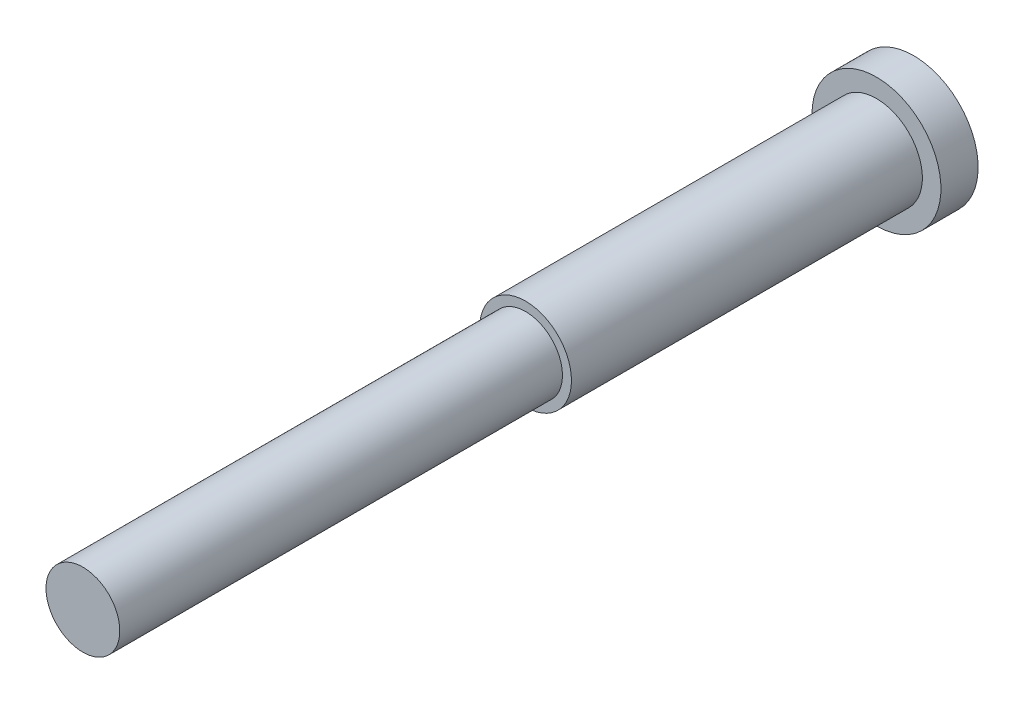
ISO-10303-21;
HEADER;
FILE_DESCRIPTION(('STEP AP214'),'2;1');
FILE_NAME('part.step','',(''),(''),'','','');
FILE_SCHEMA(('AUTOMOTIVE_DESIGN { 1 0 10303 214 1 1 1 1 }'));
ENDSEC;
DATA;
#1=APPLICATION_CONTEXT('core data for automotive mechanical design processes');
#2=APPLICATION_PROTOCOL_DEFINITION('international standard','automotive_design',2000,#1);
#3=PRODUCT_CONTEXT('',#1,'mechanical');
#4=PRODUCT('Part','Part','',(#3));
#5=PRODUCT_RELATED_PRODUCT_CATEGORY('part','',(#4));
#6=PRODUCT_DEFINITION_FORMATION('','',#4);
#7=PRODUCT_DEFINITION_CONTEXT('part definition',#1,'design');
#8=PRODUCT_DEFINITION('design','',#6,#7);
#9=PRODUCT_DEFINITION_SHAPE('','',#8);
#10=(LENGTH_UNIT() NAMED_UNIT(*) SI_UNIT(.MILLI.,.METRE.));
#11=(NAMED_UNIT(*) PLANE_ANGLE_UNIT() SI_UNIT($,.RADIAN.));
#12=(NAMED_UNIT(*) SI_UNIT($,.STERADIAN.) SOLID_ANGLE_UNIT());
#13=UNCERTAINTY_MEASURE_WITH_UNIT(LENGTH_MEASURE(1.E-05),#10,'distance_accuracy_value','');
#14=(GEOMETRIC_REPRESENTATION_CONTEXT(3) GLOBAL_UNCERTAINTY_ASSIGNED_CONTEXT((#13)) GLOBAL_UNIT_ASSIGNED_CONTEXT((#10,
#11,#12)) REPRESENTATION_CONTEXT('',''));
#15=CARTESIAN_POINT('',(0.,0.,0.));
#16=DIRECTION('',(0.,0.,1.));
#17=DIRECTION('',(1.,0.,0.));
#18=AXIS2_PLACEMENT_3D('',#15,#16,#17);
#19=CARTESIAN_POINT('',(0.,0.,60.4));
#20=DIRECTION('',(0.,0.,1.));
#21=DIRECTION('',(1.,0.,0.));
#22=AXIS2_PLACEMENT_3D('',#19,#20,#21);
#23=PLANE('',#22);
#24=CARTESIAN_POINT('',(0.,0.,60.4));
#25=DIRECTION('',(0.,0.,1.));
#26=DIRECTION('',(1.,0.,0.));
#27=AXIS2_PLACEMENT_3D('',#24,#25,#26);
#28=CIRCLE('',#27,7.9);
#29=CARTESIAN_POINT('',(7.9,0.,60.4));
#30=VERTEX_POINT('',#29);
#31=EDGE_CURVE('E10',#30,#30,#28,.T.);
#32=ORIENTED_EDGE('',*,*,#31,.T.);
#33=EDGE_LOOP('',(#32));
#34=FACE_BOUND('',#33,.T.);
#35=CARTESIAN_POINT('',(0.,0.,60.4));
#36=DIRECTION('',(0.,0.,1.));
#37=DIRECTION('',(1.,0.,0.));
#38=AXIS2_PLACEMENT_3D('',#35,#36,#37);
#39=CIRCLE('',#38,6.35);
#40=CARTESIAN_POINT('',(-6.35,0.,60.4));
#41=VERTEX_POINT('',#40);
#42=EDGE_CURVE('E43',#41,#41,#39,.T.);
#43=ORIENTED_EDGE('',*,*,#42,.F.);
#44=EDGE_LOOP('',(#43));
#45=FACE_BOUND('',#44,.T.);
#46=ADVANCED_FACE('F32',(#34,#45),#23,.T.);
#47=CARTESIAN_POINT('',(0.,0.,60.4));
#48=DIRECTION('',(0.,0.,-1.));
#49=DIRECTION('',(-1.,0.,0.));
#50=AXIS2_PLACEMENT_3D('',#47,#48,#49);
#51=CYLINDRICAL_SURFACE('',#50,7.9);
#52=ORIENTED_EDGE('',*,*,#31,.F.);
#53=EDGE_LOOP('',(#52));
#54=FACE_BOUND('',#53,.T.);
#55=CARTESIAN_POINT('',(0.,0.,0.));
#56=DIRECTION('',(0.,0.,-1.));
#57=DIRECTION('',(-1.,0.,0.));
#58=AXIS2_PLACEMENT_3D('',#55,#56,#57);
#59=CIRCLE('',#58,7.9);
#60=CARTESIAN_POINT('',(-7.9,0.,0.));
#61=VERTEX_POINT('',#60);
#62=EDGE_CURVE('E48',#61,#61,#59,.T.);
#63=ORIENTED_EDGE('',*,*,#62,.F.);
#64=EDGE_LOOP('',(#63));
#65=FACE_BOUND('',#64,.T.);
#66=ADVANCED_FACE('F34',(#54,#65),#51,.T.);
#67=CARTESIAN_POINT('',(0.,0.,136.6));
#68=DIRECTION('',(0.,0.,-1.));
#69=DIRECTION('',(-1.,0.,0.));
#70=AXIS2_PLACEMENT_3D('',#67,#68,#69);
#71=CYLINDRICAL_SURFACE('',#70,6.35);
#72=CARTESIAN_POINT('',(0.,0.,136.6));
#73=DIRECTION('',(0.,0.,1.));
#74=DIRECTION('',(1.,0.,0.));
#75=AXIS2_PLACEMENT_3D('',#72,#73,#74);
#76=CIRCLE('',#75,6.35);
#77=CARTESIAN_POINT('',(-6.35,0.,136.6));
#78=VERTEX_POINT('',#77);
#79=EDGE_CURVE('E39',#78,#78,#76,.T.);
#80=CARTESIAN_POINT('',(-6.35,0.,136.6));
#81=CARTESIAN_POINT('',(-6.35,0.,135.80625));
#82=CARTESIAN_POINT('',(-6.35,0.,135.0125));
#83=CARTESIAN_POINT('',(-6.35,0.,133.425));
#84=CARTESIAN_POINT('',(-6.35,0.,132.63125));
#85=CARTESIAN_POINT('',(-6.35,0.,131.04375));
#86=CARTESIAN_POINT('',(-6.35,0.,130.25));
#87=CARTESIAN_POINT('',(-6.35,0.,128.6625));
#88=CARTESIAN_POINT('',(-6.35,0.,127.86875));
#89=CARTESIAN_POINT('',(-6.35,0.,126.28125));
#90=CARTESIAN_POINT('',(-6.35,0.,125.4875));
#91=CARTESIAN_POINT('',(-6.35,0.,123.9));
#92=CARTESIAN_POINT('',(-6.35,0.,123.10625));
#93=CARTESIAN_POINT('',(-6.35,0.,121.51875));
#94=CARTESIAN_POINT('',(-6.35,0.,120.725));
#95=CARTESIAN_POINT('',(-6.35,0.,119.1375));
#96=CARTESIAN_POINT('',(-6.35,0.,118.34375));
#97=CARTESIAN_POINT('',(-6.35,0.,116.75625));
#98=CARTESIAN_POINT('',(-6.35,0.,115.9625));
#99=CARTESIAN_POINT('',(-6.35,0.,114.375));
#100=CARTESIAN_POINT('',(-6.35,0.,113.58125));
#101=CARTESIAN_POINT('',(-6.35,0.,111.99375));
#102=CARTESIAN_POINT('',(-6.35,0.,111.2));
#103=CARTESIAN_POINT('',(-6.35,0.,109.6125));
#104=CARTESIAN_POINT('',(-6.35,0.,108.81875));
#105=CARTESIAN_POINT('',(-6.35,0.,107.23125));
#106=CARTESIAN_POINT('',(-6.35,0.,106.4375));
#107=CARTESIAN_POINT('',(-6.35,0.,104.85));
#108=CARTESIAN_POINT('',(-6.35,0.,104.05625));
#109=CARTESIAN_POINT('',(-6.35,0.,102.46875));
#110=CARTESIAN_POINT('',(-6.35,0.,101.675));
#111=CARTESIAN_POINT('',(-6.35,0.,100.0875));
#112=CARTESIAN_POINT('',(-6.35,0.,99.29375));
#113=CARTESIAN_POINT('',(-6.35,0.,97.70625));
#114=CARTESIAN_POINT('',(-6.35,0.,96.9125));
#115=CARTESIAN_POINT('',(-6.35,0.,95.325));
#116=CARTESIAN_POINT('',(-6.35,0.,94.53125));
#117=CARTESIAN_POINT('',(-6.35,0.,92.94375));
#118=CARTESIAN_POINT('',(-6.35,0.,92.15));
#119=CARTESIAN_POINT('',(-6.35,0.,90.5625));
#120=CARTESIAN_POINT('',(-6.35,0.,89.76875));
#121=CARTESIAN_POINT('',(-6.35,0.,88.18125));
#122=CARTESIAN_POINT('',(-6.35,0.,87.3875));
#123=CARTESIAN_POINT('',(-6.35,0.,85.8));
#124=CARTESIAN_POINT('',(-6.35,0.,85.00625));
#125=CARTESIAN_POINT('',(-6.35,0.,83.41875));
#126=CARTESIAN_POINT('',(-6.35,0.,82.625));
#127=CARTESIAN_POINT('',(-6.35,0.,81.0375));
#128=CARTESIAN_POINT('',(-6.35,0.,80.24375));
#129=CARTESIAN_POINT('',(-6.35,0.,78.65625));
#130=CARTESIAN_POINT('',(-6.35,0.,77.8625));
#131=CARTESIAN_POINT('',(-6.35,0.,76.275));
#132=CARTESIAN_POINT('',(-6.35,0.,75.48125));
#133=CARTESIAN_POINT('',(-6.35,0.,73.89375));
#134=CARTESIAN_POINT('',(-6.35,0.,73.1));
#135=CARTESIAN_POINT('',(-6.35,0.,71.5125));
#136=CARTESIAN_POINT('',(-6.35,0.,70.71875));
#137=CARTESIAN_POINT('',(-6.35,0.,69.13125));
#138=CARTESIAN_POINT('',(-6.35,0.,68.3375));
#139=CARTESIAN_POINT('',(-6.35,0.,66.75));
#140=CARTESIAN_POINT('',(-6.35,0.,65.95625));
#141=CARTESIAN_POINT('',(-6.35,0.,64.36875));
#142=CARTESIAN_POINT('',(-6.35,0.,63.575));
#143=CARTESIAN_POINT('',(-6.35,0.,61.9875));
#144=CARTESIAN_POINT('',(-6.35,0.,61.19375));
#145=CARTESIAN_POINT('',(-6.35,0.,60.4));
#146=B_SPLINE_CURVE_WITH_KNOTS('',3,(#80,#81,#82,#83,#84,#85,#86,#87,#88,#89,#90,#91,#92,#93,
#94,#95,#96,#97,#98,#99,#100,#101,#102,#103,#104,#105,#106,#107,#108,#109,#110,#111,#112,#113,
#114,#115,#116,#117,#118,#119,#120,#121,#122,#123,#124,#125,#126,#127,#128,#129,#130,#131,#132,
#133,#134,#135,#136,#137,#138,#139,#140,#141,#142,#143,#144,#145),.UNSPECIFIED.,.F.,.F.,(4,2,2,
2,2,2,2,2,2,2,2,2,2,2,2,2,2,2,2,2,2,2,2,2,2,2,2,2,2,2,2,2,4),(0.,2.38124999999997,
4.76249999999998,7.14374999999998,9.52499999999998,11.90625,14.2875,16.66875,19.05,21.43125,
23.8125,26.19375,28.575,30.95625,33.3375,35.71875,38.1,40.48125,42.8625,45.24375,47.625,
50.00625,52.3875,54.76875,57.15,59.53125,61.9125,64.29375,66.675,69.05625,71.4375,73.81875,
76.2),.UNSPECIFIED.);
#147=EDGE_CURVE('BSEAM75',#78,#41,#146,.T.);
#148=ORIENTED_EDGE('',*,*,#79,.F.);
#149=ORIENTED_EDGE('',*,*,#42,.T.);
#150=ORIENTED_EDGE('',*,*,#147,.T.);
#151=ORIENTED_EDGE('',*,*,#147,.F.);
#152=EDGE_LOOP('',(#148,#150,#149,#151));
#153=FACE_BOUND('',#152,.T.);
#154=ADVANCED_FACE('F75',(#153),#71,.T.);
#155=CARTESIAN_POINT('',(0.,0.,136.6));
#156=DIRECTION('',(0.,0.,1.));
#157=DIRECTION('',(1.,0.,0.));
#158=AXIS2_PLACEMENT_3D('',#155,#156,#157);
#159=PLANE('',#158);
#160=ORIENTED_EDGE('',*,*,#79,.T.);
#161=EDGE_LOOP('',(#160));
#162=FACE_BOUND('',#161,.T.);
#163=ADVANCED_FACE('F70',(#162),#159,.T.);
#164=CARTESIAN_POINT('',(0.,0.,0.));
#165=DIRECTION('',(0.,0.,-1.));
#166=DIRECTION('',(-1.,0.,0.));
#167=AXIS2_PLACEMENT_3D('',#164,#165,#166);
#168=PLANE('',#167);
#169=CARTESIAN_POINT('',(0.,0.,0.));
#170=DIRECTION('',(0.,0.,-1.));
#171=DIRECTION('',(-1.,0.,0.));
#172=AXIS2_PLACEMENT_3D('',#169,#170,#171);
#173=CIRCLE('',#172,11.1);
#174=CARTESIAN_POINT('',(-11.1,0.,0.));
#175=VERTEX_POINT('',#174);
#176=EDGE_CURVE('E53',#175,#175,#173,.T.);
#177=ORIENTED_EDGE('',*,*,#176,.F.);
#178=EDGE_LOOP('',(#177));
#179=FACE_BOUND('',#178,.T.);
#180=ORIENTED_EDGE('',*,*,#62,.T.);
#181=EDGE_LOOP('',(#180));
#182=FACE_BOUND('',#181,.T.);
#183=ADVANCED_FACE('F64',(#179,#182),#168,.F.);
#184=CARTESIAN_POINT('',(0.,0.,-6.4));
#185=DIRECTION('',(0.,0.,1.));
#186=DIRECTION('',(1.,0.,0.));
#187=AXIS2_PLACEMENT_3D('',#184,#185,#186);
#188=CYLINDRICAL_SURFACE('',#187,11.1);
#189=CARTESIAN_POINT('',(0.,0.,-6.4));
#190=DIRECTION('',(0.,0.,-1.));
#191=DIRECTION('',(-1.,0.,0.));
#192=AXIS2_PLACEMENT_3D('',#189,#190,#191);
#193=CIRCLE('',#192,11.1);
#194=CARTESIAN_POINT('',(-11.1,0.,-6.4));
#195=VERTEX_POINT('',#194);
#196=EDGE_CURVE('E52',#195,#195,#193,.T.);
#197=ORIENTED_EDGE('',*,*,#196,.F.);
#198=EDGE_LOOP('',(#197));
#199=FACE_BOUND('',#198,.T.);
#200=ORIENTED_EDGE('',*,*,#176,.T.);
#201=EDGE_LOOP('',(#200));
#202=FACE_BOUND('',#201,.T.);
#203=ADVANCED_FACE('F61',(#199,#202),#188,.T.);
#204=CARTESIAN_POINT('',(0.,0.,-6.4));
#205=DIRECTION('',(0.,0.,-1.));
#206=DIRECTION('',(-1.,0.,0.));
#207=AXIS2_PLACEMENT_3D('',#204,#205,#206);
#208=PLANE('',#207);
#209=ORIENTED_EDGE('',*,*,#196,.T.);
#210=EDGE_LOOP('',(#209));
#211=FACE_BOUND('',#210,.T.);
#212=ADVANCED_FACE('F59',(#211),#208,.T.);
#213=CLOSED_SHELL('',(#46,#66,#154,#163,#183,#203,#212));
#214=MANIFOLD_SOLID_BREP('B2',#213);
#215=ADVANCED_BREP_SHAPE_REPRESENTATION('',(#18,#214),#14);
#216=SHAPE_DEFINITION_REPRESENTATION(#9,#215);
ENDSEC;
END-ISO-10303-21;
